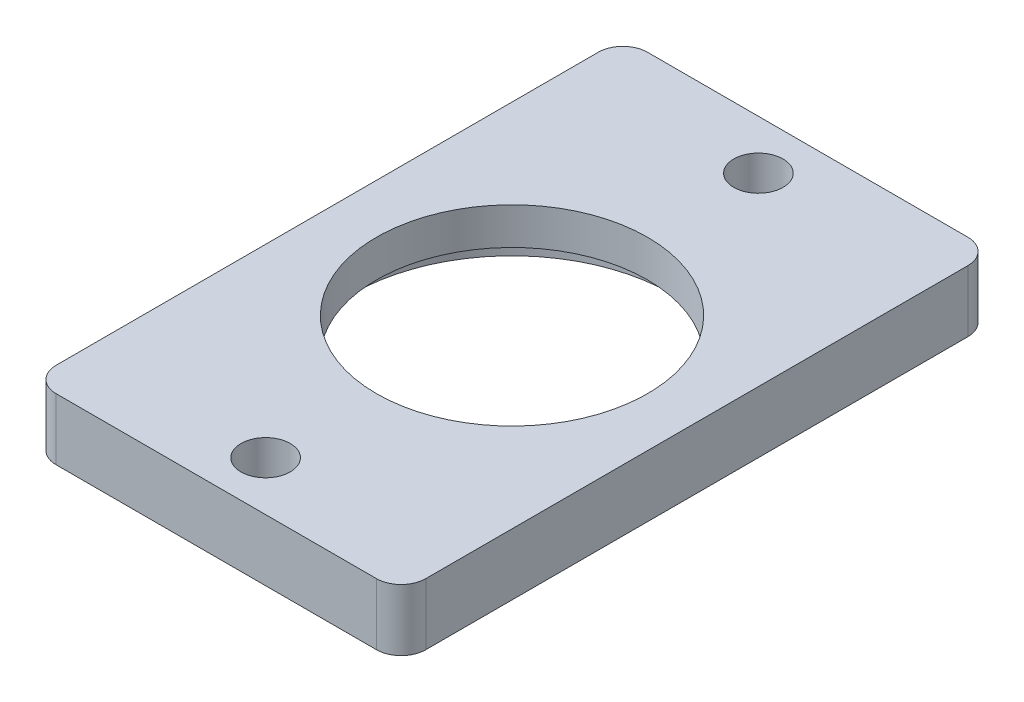
ISO-10303-21;
HEADER;
FILE_DESCRIPTION(('STEP AP214'),'2;1');
FILE_NAME('part.step','',(''),(''),'','','');
FILE_SCHEMA(('AUTOMOTIVE_DESIGN { 1 0 10303 214 1 1 1 1 }'));
ENDSEC;
DATA;
#1=APPLICATION_CONTEXT('core data for automotive mechanical design processes');
#2=APPLICATION_PROTOCOL_DEFINITION('international standard','automotive_design',2000,#1);
#3=PRODUCT_CONTEXT('',#1,'mechanical');
#4=PRODUCT('Part','Part','',(#3));
#5=PRODUCT_RELATED_PRODUCT_CATEGORY('part','',(#4));
#6=PRODUCT_DEFINITION_FORMATION('','',#4);
#7=PRODUCT_DEFINITION_CONTEXT('part definition',#1,'design');
#8=PRODUCT_DEFINITION('design','',#6,#7);
#9=PRODUCT_DEFINITION_SHAPE('','',#8);
#10=(LENGTH_UNIT() NAMED_UNIT(*) SI_UNIT(.MILLI.,.METRE.));
#11=(NAMED_UNIT(*) PLANE_ANGLE_UNIT() SI_UNIT($,.RADIAN.));
#12=(NAMED_UNIT(*) SI_UNIT($,.STERADIAN.) SOLID_ANGLE_UNIT());
#13=UNCERTAINTY_MEASURE_WITH_UNIT(LENGTH_MEASURE(1.E-05),#10,'distance_accuracy_value','');
#14=(GEOMETRIC_REPRESENTATION_CONTEXT(3) GLOBAL_UNCERTAINTY_ASSIGNED_CONTEXT((#13)) GLOBAL_UNIT_ASSIGNED_CONTEXT((#10,
#11,#12)) REPRESENTATION_CONTEXT('',''));
#15=CARTESIAN_POINT('',(0.,0.,0.));
#16=DIRECTION('',(0.,0.,1.));
#17=DIRECTION('',(1.,0.,0.));
#18=AXIS2_PLACEMENT_3D('',#15,#16,#17);
#19=CARTESIAN_POINT('',(-13.,5.,-22.));
#20=DIRECTION('',(0.,-1.,0.));
#21=DIRECTION('',(0.,0.,-1.));
#22=AXIS2_PLACEMENT_3D('',#19,#20,#21);
#23=CYLINDRICAL_SURFACE('',#22,2.);
#24=CARTESIAN_POINT('',(-13.,0.,-22.));
#25=DIRECTION('',(0.,1.,0.));
#26=DIRECTION('',(0.,0.,1.));
#27=AXIS2_PLACEMENT_3D('',#24,#25,#26);
#28=CIRCLE('',#27,2.);
#29=CARTESIAN_POINT('',(-15.,0.,-22.));
#30=VERTEX_POINT('',#29);
#31=CARTESIAN_POINT('',(-13.,0.,-24.));
#32=VERTEX_POINT('',#31);
#33=EDGE_CURVE('E140',#30,#32,#28,.F.);
#34=ORIENTED_EDGE('',*,*,#33,.F.);
#35=DIRECTION('',(0.,-1.,0.));
#36=VECTOR('',#35,1.);
#37=CARTESIAN_POINT('',(-15.,5.,-22.));
#38=LINE('',#37,#36);
#39=CARTESIAN_POINT('',(-15.,5.,-22.));
#40=VERTEX_POINT('',#39);
#41=EDGE_CURVE('E11',#40,#30,#38,.T.);
#42=ORIENTED_EDGE('',*,*,#41,.F.);
#43=CARTESIAN_POINT('',(-13.,5.,-22.));
#44=DIRECTION('',(0.,1.,0.));
#45=DIRECTION('',(0.,0.,1.));
#46=AXIS2_PLACEMENT_3D('',#43,#44,#45);
#47=CIRCLE('',#46,2.);
#48=CARTESIAN_POINT('',(-13.,5.,-24.));
#49=VERTEX_POINT('',#48);
#50=EDGE_CURVE('E165',#40,#49,#47,.F.);
#51=ORIENTED_EDGE('',*,*,#50,.T.);
#52=DIRECTION('',(0.,-1.,0.));
#53=VECTOR('',#52,1.);
#54=CARTESIAN_POINT('',(-13.,5.,-24.));
#55=LINE('',#54,#53);
#56=EDGE_CURVE('E53',#49,#32,#55,.T.);
#57=ORIENTED_EDGE('',*,*,#56,.T.);
#58=EDGE_LOOP('',(#34,#42,#51,#57));
#59=FACE_BOUND('',#58,.T.);
#60=ADVANCED_FACE('F37',(#59),#23,.T.);
#61=CARTESIAN_POINT('',(-15.,5.,0.));
#62=DIRECTION('',(-1.,0.,0.));
#63=DIRECTION('',(0.,0.,1.));
#64=AXIS2_PLACEMENT_3D('',#61,#62,#63);
#65=PLANE('',#64);
#66=DIRECTION('',(0.,0.,-1.));
#67=VECTOR('',#66,1.);
#68=CARTESIAN_POINT('',(-15.,0.,0.));
#69=LINE('',#68,#67);
#70=CARTESIAN_POINT('',(-15.,0.,22.));
#71=VERTEX_POINT('',#70);
#72=EDGE_CURVE('E142',#71,#30,#69,.T.);
#73=ORIENTED_EDGE('',*,*,#72,.F.);
#74=DIRECTION('',(0.,-1.,0.));
#75=VECTOR('',#74,1.);
#76=CARTESIAN_POINT('',(-15.,5.,22.));
#77=LINE('',#76,#75);
#78=CARTESIAN_POINT('',(-15.,5.,22.));
#79=VERTEX_POINT('',#78);
#80=EDGE_CURVE('E45',#79,#71,#77,.T.);
#81=ORIENTED_EDGE('',*,*,#80,.F.);
#82=DIRECTION('',(0.,0.,-1.));
#83=VECTOR('',#82,1.);
#84=CARTESIAN_POINT('',(-15.,5.,0.));
#85=LINE('',#84,#83);
#86=EDGE_CURVE('E199',#79,#40,#85,.T.);
#87=ORIENTED_EDGE('',*,*,#86,.T.);
#88=ORIENTED_EDGE('',*,*,#41,.T.);
#89=EDGE_LOOP('',(#73,#81,#87,#88));
#90=FACE_BOUND('',#89,.T.);
#91=ADVANCED_FACE('F183',(#90),#65,.T.);
#92=CARTESIAN_POINT('',(-13.,5.,22.));
#93=DIRECTION('',(0.,-1.,0.));
#94=DIRECTION('',(0.,0.,-1.));
#95=AXIS2_PLACEMENT_3D('',#92,#93,#94);
#96=CYLINDRICAL_SURFACE('',#95,2.);
#97=CARTESIAN_POINT('',(-13.,0.,22.));
#98=DIRECTION('',(0.,1.,0.));
#99=DIRECTION('',(0.,0.,1.));
#100=AXIS2_PLACEMENT_3D('',#97,#98,#99);
#101=CIRCLE('',#100,2.);
#102=CARTESIAN_POINT('',(-13.,0.,24.));
#103=VERTEX_POINT('',#102);
#104=EDGE_CURVE('E146',#103,#71,#101,.F.);
#105=ORIENTED_EDGE('',*,*,#104,.F.);
#106=DIRECTION('',(0.,-1.,0.));
#107=VECTOR('',#106,1.);
#108=CARTESIAN_POINT('',(-13.,5.,24.));
#109=LINE('',#108,#107);
#110=CARTESIAN_POINT('',(-13.,5.,24.));
#111=VERTEX_POINT('',#110);
#112=EDGE_CURVE('E172',#111,#103,#109,.T.);
#113=ORIENTED_EDGE('',*,*,#112,.F.);
#114=CARTESIAN_POINT('',(-13.,5.,22.));
#115=DIRECTION('',(0.,1.,0.));
#116=DIRECTION('',(0.,0.,1.));
#117=AXIS2_PLACEMENT_3D('',#114,#115,#116);
#118=CIRCLE('',#117,2.);
#119=EDGE_CURVE('E179',#111,#79,#118,.F.);
#120=ORIENTED_EDGE('',*,*,#119,.T.);
#121=ORIENTED_EDGE('',*,*,#80,.T.);
#122=EDGE_LOOP('',(#105,#113,#120,#121));
#123=FACE_BOUND('',#122,.T.);
#124=ADVANCED_FACE('F177',(#123),#96,.T.);
#125=CARTESIAN_POINT('',(0.,5.,24.));
#126=DIRECTION('',(0.,0.,-1.));
#127=DIRECTION('',(-1.,0.,0.));
#128=AXIS2_PLACEMENT_3D('',#125,#126,#127);
#129=PLANE('',#128);
#130=DIRECTION('',(1.,0.,0.));
#131=VECTOR('',#130,1.);
#132=CARTESIAN_POINT('',(0.,0.,24.));
#133=LINE('',#132,#131);
#134=CARTESIAN_POINT('',(13.,0.,24.));
#135=VERTEX_POINT('',#134);
#136=EDGE_CURVE('E149',#103,#135,#133,.T.);
#137=ORIENTED_EDGE('',*,*,#136,.T.);
#138=DIRECTION('',(0.,-1.,0.));
#139=VECTOR('',#138,1.);
#140=CARTESIAN_POINT('',(13.,5.,24.));
#141=LINE('',#140,#139);
#142=CARTESIAN_POINT('',(13.,5.,24.));
#143=VERTEX_POINT('',#142);
#144=EDGE_CURVE('E169',#143,#135,#141,.T.);
#145=ORIENTED_EDGE('',*,*,#144,.F.);
#146=DIRECTION('',(1.,0.,0.));
#147=VECTOR('',#146,1.);
#148=CARTESIAN_POINT('',(0.,5.,24.));
#149=LINE('',#148,#147);
#150=EDGE_CURVE('E195',#111,#143,#149,.T.);
#151=ORIENTED_EDGE('',*,*,#150,.F.);
#152=ORIENTED_EDGE('',*,*,#112,.T.);
#153=EDGE_LOOP('',(#137,#145,#151,#152));
#154=FACE_BOUND('',#153,.T.);
#155=ADVANCED_FACE('F191',(#154),#129,.F.);
#156=CARTESIAN_POINT('',(13.,5.,22.));
#157=DIRECTION('',(0.,-1.,0.));
#158=DIRECTION('',(0.,0.,-1.));
#159=AXIS2_PLACEMENT_3D('',#156,#157,#158);
#160=CYLINDRICAL_SURFACE('',#159,2.);
#161=CARTESIAN_POINT('',(13.,0.,22.));
#162=DIRECTION('',(0.,1.,0.));
#163=DIRECTION('',(0.,0.,1.));
#164=AXIS2_PLACEMENT_3D('',#161,#162,#163);
#165=CIRCLE('',#164,2.);
#166=CARTESIAN_POINT('',(15.,0.,22.));
#167=VERTEX_POINT('',#166);
#168=EDGE_CURVE('E151',#135,#167,#165,.T.);
#169=ORIENTED_EDGE('',*,*,#168,.T.);
#170=DIRECTION('',(0.,-1.,0.));
#171=VECTOR('',#170,1.);
#172=CARTESIAN_POINT('',(15.,5.,22.));
#173=LINE('',#172,#171);
#174=CARTESIAN_POINT('',(15.,5.,22.));
#175=VERTEX_POINT('',#174);
#176=EDGE_CURVE('E123',#175,#167,#173,.T.);
#177=ORIENTED_EDGE('',*,*,#176,.F.);
#178=CARTESIAN_POINT('',(13.,5.,22.));
#179=DIRECTION('',(0.,1.,0.));
#180=DIRECTION('',(0.,0.,1.));
#181=AXIS2_PLACEMENT_3D('',#178,#179,#180);
#182=CIRCLE('',#181,2.);
#183=EDGE_CURVE('E111',#143,#175,#182,.T.);
#184=ORIENTED_EDGE('',*,*,#183,.F.);
#185=ORIENTED_EDGE('',*,*,#144,.T.);
#186=EDGE_LOOP('',(#169,#177,#184,#185));
#187=FACE_BOUND('',#186,.T.);
#188=ADVANCED_FACE('F194',(#187),#160,.T.);
#189=CARTESIAN_POINT('',(15.,5.,0.));
#190=DIRECTION('',(-1.,0.,0.));
#191=DIRECTION('',(0.,0.,1.));
#192=AXIS2_PLACEMENT_3D('',#189,#190,#191);
#193=PLANE('',#192);
#194=DIRECTION('',(0.,0.,-1.));
#195=VECTOR('',#194,1.);
#196=CARTESIAN_POINT('',(15.,0.,0.));
#197=LINE('',#196,#195);
#198=CARTESIAN_POINT('',(15.,0.,-22.));
#199=VERTEX_POINT('',#198);
#200=EDGE_CURVE('E120',#167,#199,#197,.T.);
#201=ORIENTED_EDGE('',*,*,#200,.T.);
#202=DIRECTION('',(0.,-1.,0.));
#203=VECTOR('',#202,1.);
#204=CARTESIAN_POINT('',(15.,5.,-22.));
#205=LINE('',#204,#203);
#206=CARTESIAN_POINT('',(15.,5.,-22.));
#207=VERTEX_POINT('',#206);
#208=EDGE_CURVE('E117',#207,#199,#205,.T.);
#209=ORIENTED_EDGE('',*,*,#208,.F.);
#210=DIRECTION('',(0.,0.,-1.));
#211=VECTOR('',#210,1.);
#212=CARTESIAN_POINT('',(15.,5.,0.));
#213=LINE('',#212,#211);
#214=EDGE_CURVE('E103',#175,#207,#213,.T.);
#215=ORIENTED_EDGE('',*,*,#214,.F.);
#216=ORIENTED_EDGE('',*,*,#176,.T.);
#217=EDGE_LOOP('',(#201,#209,#215,#216));
#218=FACE_BOUND('',#217,.T.);
#219=ADVANCED_FACE('F118',(#218),#193,.F.);
#220=CARTESIAN_POINT('',(13.,5.,-22.));
#221=DIRECTION('',(0.,-1.,0.));
#222=DIRECTION('',(0.,0.,-1.));
#223=AXIS2_PLACEMENT_3D('',#220,#221,#222);
#224=CYLINDRICAL_SURFACE('',#223,2.);
#225=CARTESIAN_POINT('',(13.,0.,-22.));
#226=DIRECTION('',(0.,1.,0.));
#227=DIRECTION('',(0.,0.,1.));
#228=AXIS2_PLACEMENT_3D('',#225,#226,#227);
#229=CIRCLE('',#228,2.);
#230=CARTESIAN_POINT('',(13.,0.,-24.));
#231=VERTEX_POINT('',#230);
#232=EDGE_CURVE('E154',#199,#231,#229,.T.);
#233=ORIENTED_EDGE('',*,*,#232,.T.);
#234=DIRECTION('',(0.,-1.,0.));
#235=VECTOR('',#234,1.);
#236=CARTESIAN_POINT('',(13.,5.,-24.));
#237=LINE('',#236,#235);
#238=CARTESIAN_POINT('',(13.,5.,-24.));
#239=VERTEX_POINT('',#238);
#240=EDGE_CURVE('E79',#239,#231,#237,.T.);
#241=ORIENTED_EDGE('',*,*,#240,.F.);
#242=CARTESIAN_POINT('',(13.,5.,-22.));
#243=DIRECTION('',(0.,1.,0.));
#244=DIRECTION('',(0.,0.,1.));
#245=AXIS2_PLACEMENT_3D('',#242,#243,#244);
#246=CIRCLE('',#245,2.);
#247=EDGE_CURVE('E109',#207,#239,#246,.T.);
#248=ORIENTED_EDGE('',*,*,#247,.F.);
#249=ORIENTED_EDGE('',*,*,#208,.T.);
#250=EDGE_LOOP('',(#233,#241,#248,#249));
#251=FACE_BOUND('',#250,.T.);
#252=ADVANCED_FACE('F125',(#251),#224,.T.);
#253=CARTESIAN_POINT('',(0.,5.,-20.));
#254=DIRECTION('',(0.,-1.,0.));
#255=DIRECTION('',(0.,0.,-1.));
#256=AXIS2_PLACEMENT_3D('',#253,#254,#255);
#257=CYLINDRICAL_SURFACE('',#256,2.);
#258=CARTESIAN_POINT('',(0.,5.,-20.));
#259=DIRECTION('',(0.,1.,0.));
#260=DIRECTION('',(0.,0.,1.));
#261=AXIS2_PLACEMENT_3D('',#258,#259,#260);
#262=CIRCLE('',#261,2.);
#263=CARTESIAN_POINT('',(0.,5.,-18.));
#264=VERTEX_POINT('',#263);
#265=EDGE_CURVE('E134',#264,#264,#262,.T.);
#266=ORIENTED_EDGE('',*,*,#265,.T.);
#267=EDGE_LOOP('',(#266));
#268=FACE_BOUND('',#267,.T.);
#269=CARTESIAN_POINT('',(0.,0.,-20.));
#270=DIRECTION('',(0.,1.,0.));
#271=DIRECTION('',(0.,0.,1.));
#272=AXIS2_PLACEMENT_3D('',#269,#270,#271);
#273=CIRCLE('',#272,2.);
#274=CARTESIAN_POINT('',(0.,0.,-18.));
#275=VERTEX_POINT('',#274);
#276=EDGE_CURVE('E162',#275,#275,#273,.T.);
#277=ORIENTED_EDGE('',*,*,#276,.F.);
#278=EDGE_LOOP('',(#277));
#279=FACE_BOUND('',#278,.T.);
#280=ADVANCED_FACE('F240',(#268,#279),#257,.F.);
#281=CARTESIAN_POINT('',(0.,5.,20.));
#282=DIRECTION('',(0.,-1.,0.));
#283=DIRECTION('',(0.,0.,-1.));
#284=AXIS2_PLACEMENT_3D('',#281,#282,#283);
#285=CYLINDRICAL_SURFACE('',#284,2.);
#286=CARTESIAN_POINT('',(0.,5.,20.));
#287=DIRECTION('',(0.,1.,0.));
#288=DIRECTION('',(0.,0.,1.));
#289=AXIS2_PLACEMENT_3D('',#286,#287,#288);
#290=CIRCLE('',#289,2.);
#291=CARTESIAN_POINT('',(0.,5.,22.));
#292=VERTEX_POINT('',#291);
#293=EDGE_CURVE('E128',#292,#292,#290,.T.);
#294=ORIENTED_EDGE('',*,*,#293,.T.);
#295=EDGE_LOOP('',(#294));
#296=FACE_BOUND('',#295,.T.);
#297=CARTESIAN_POINT('',(0.,0.,20.));
#298=DIRECTION('',(0.,1.,0.));
#299=DIRECTION('',(0.,0.,1.));
#300=AXIS2_PLACEMENT_3D('',#297,#298,#299);
#301=CIRCLE('',#300,2.);
#302=CARTESIAN_POINT('',(0.,0.,22.));
#303=VERTEX_POINT('',#302);
#304=EDGE_CURVE('E159',#303,#303,#301,.T.);
#305=ORIENTED_EDGE('',*,*,#304,.F.);
#306=EDGE_LOOP('',(#305));
#307=FACE_BOUND('',#306,.T.);
#308=ADVANCED_FACE('F235',(#296,#307),#285,.F.);
#309=CARTESIAN_POINT('',(0.,5.,-24.));
#310=DIRECTION('',(0.,0.,-1.));
#311=DIRECTION('',(-1.,0.,0.));
#312=AXIS2_PLACEMENT_3D('',#309,#310,#311);
#313=PLANE('',#312);
#314=DIRECTION('',(1.,0.,0.));
#315=VECTOR('',#314,1.);
#316=CARTESIAN_POINT('',(0.,0.,-24.));
#317=LINE('',#316,#315);
#318=EDGE_CURVE('E156',#32,#231,#317,.T.);
#319=ORIENTED_EDGE('',*,*,#318,.F.);
#320=ORIENTED_EDGE('',*,*,#56,.F.);
#321=DIRECTION('',(1.,0.,0.));
#322=VECTOR('',#321,1.);
#323=CARTESIAN_POINT('',(0.,5.,-24.));
#324=LINE('',#323,#322);
#325=EDGE_CURVE('E126',#49,#239,#324,.T.);
#326=ORIENTED_EDGE('',*,*,#325,.T.);
#327=ORIENTED_EDGE('',*,*,#240,.T.);
#328=EDGE_LOOP('',(#319,#320,#326,#327));
#329=FACE_BOUND('',#328,.T.);
#330=ADVANCED_FACE('F217',(#329),#313,.T.);
#331=CARTESIAN_POINT('',(0.,5.,0.));
#332=DIRECTION('',(0.,-1.,0.));
#333=DIRECTION('',(0.,0.,-1.));
#334=AXIS2_PLACEMENT_3D('',#331,#332,#333);
#335=CYLINDRICAL_SURFACE('',#334,11.);
#336=CARTESIAN_POINT('',(0.,2.,0.));
#337=DIRECTION('',(0.,1.,0.));
#338=DIRECTION('',(0.,0.,1.));
#339=AXIS2_PLACEMENT_3D('',#336,#337,#338);
#340=CIRCLE('',#339,11.);
#341=CARTESIAN_POINT('',(0.,2.,11.));
#342=VERTEX_POINT('',#341);
#343=EDGE_CURVE('E205',#342,#342,#340,.T.);
#344=ORIENTED_EDGE('',*,*,#343,.F.);
#345=EDGE_LOOP('',(#344));
#346=FACE_BOUND('',#345,.T.);
#347=CARTESIAN_POINT('',(0.,5.,0.));
#348=DIRECTION('',(0.,1.,0.));
#349=DIRECTION('',(0.,0.,1.));
#350=AXIS2_PLACEMENT_3D('',#347,#348,#349);
#351=CIRCLE('',#350,11.);
#352=CARTESIAN_POINT('',(0.,5.,11.));
#353=VERTEX_POINT('',#352);
#354=EDGE_CURVE('E137',#353,#353,#351,.T.);
#355=ORIENTED_EDGE('',*,*,#354,.T.);
#356=EDGE_LOOP('',(#355));
#357=FACE_BOUND('',#356,.T.);
#358=ADVANCED_FACE('F214',(#346,#357),#335,.F.);
#359=CARTESIAN_POINT('',(0.,5.,0.));
#360=DIRECTION('',(0.,1.,0.));
#361=DIRECTION('',(0.,0.,1.));
#362=AXIS2_PLACEMENT_3D('',#359,#360,#361);
#363=PLANE('',#362);
#364=ORIENTED_EDGE('',*,*,#50,.F.);
#365=ORIENTED_EDGE('',*,*,#86,.F.);
#366=ORIENTED_EDGE('',*,*,#119,.F.);
#367=ORIENTED_EDGE('',*,*,#150,.T.);
#368=ORIENTED_EDGE('',*,*,#183,.T.);
#369=ORIENTED_EDGE('',*,*,#214,.T.);
#370=ORIENTED_EDGE('',*,*,#247,.T.);
#371=ORIENTED_EDGE('',*,*,#325,.F.);
#372=EDGE_LOOP('',(#364,#365,#366,#367,#368,#369,#370,#371));
#373=FACE_BOUND('',#372,.T.);
#374=ORIENTED_EDGE('',*,*,#293,.F.);
#375=EDGE_LOOP('',(#374));
#376=FACE_BOUND('',#375,.T.);
#377=ORIENTED_EDGE('',*,*,#265,.F.);
#378=EDGE_LOOP('',(#377));
#379=FACE_BOUND('',#378,.T.);
#380=ORIENTED_EDGE('',*,*,#354,.F.);
#381=EDGE_LOOP('',(#380));
#382=FACE_BOUND('',#381,.T.);
#383=ADVANCED_FACE('F105',(#373,#376,#379,#382),#363,.T.);
#384=CARTESIAN_POINT('',(0.,0.,0.));
#385=DIRECTION('',(0.,1.,0.));
#386=DIRECTION('',(0.,0.,1.));
#387=AXIS2_PLACEMENT_3D('',#384,#385,#386);
#388=PLANE('',#387);
#389=CARTESIAN_POINT('',(0.,0.,0.));
#390=DIRECTION('',(0.,1.,0.));
#391=DIRECTION('',(0.,0.,1.));
#392=AXIS2_PLACEMENT_3D('',#389,#390,#391);
#393=CIRCLE('',#392,13.);
#394=CARTESIAN_POINT('',(0.,0.,13.));
#395=VERTEX_POINT('',#394);
#396=EDGE_CURVE('E202',#395,#395,#393,.T.);
#397=ORIENTED_EDGE('',*,*,#396,.T.);
#398=EDGE_LOOP('',(#397));
#399=FACE_BOUND('',#398,.T.);
#400=ORIENTED_EDGE('',*,*,#33,.T.);
#401=ORIENTED_EDGE('',*,*,#318,.T.);
#402=ORIENTED_EDGE('',*,*,#232,.F.);
#403=ORIENTED_EDGE('',*,*,#200,.F.);
#404=ORIENTED_EDGE('',*,*,#168,.F.);
#405=ORIENTED_EDGE('',*,*,#136,.F.);
#406=ORIENTED_EDGE('',*,*,#104,.T.);
#407=ORIENTED_EDGE('',*,*,#72,.T.);
#408=EDGE_LOOP('',(#400,#401,#402,#403,#404,#405,#406,#407));
#409=FACE_BOUND('',#408,.T.);
#410=ORIENTED_EDGE('',*,*,#304,.T.);
#411=EDGE_LOOP('',(#410));
#412=FACE_BOUND('',#411,.T.);
#413=ORIENTED_EDGE('',*,*,#276,.T.);
#414=EDGE_LOOP('',(#413));
#415=FACE_BOUND('',#414,.T.);
#416=ADVANCED_FACE('F186',(#399,#409,#412,#415),#388,.F.);
#417=CARTESIAN_POINT('',(0.,2.,0.));
#418=DIRECTION('',(0.,-1.,0.));
#419=DIRECTION('',(0.,0.,-1.));
#420=AXIS2_PLACEMENT_3D('',#417,#418,#419);
#421=CYLINDRICAL_SURFACE('',#420,13.);
#422=CARTESIAN_POINT('',(0.,2.,0.));
#423=DIRECTION('',(0.,1.,0.));
#424=DIRECTION('',(0.,0.,1.));
#425=AXIS2_PLACEMENT_3D('',#422,#423,#424);
#426=CIRCLE('',#425,13.);
#427=CARTESIAN_POINT('',(0.,2.,13.));
#428=VERTEX_POINT('',#427);
#429=EDGE_CURVE('E143',#428,#428,#426,.T.);
#430=ORIENTED_EDGE('',*,*,#429,.T.);
#431=EDGE_LOOP('',(#430));
#432=FACE_BOUND('',#431,.T.);
#433=ORIENTED_EDGE('',*,*,#396,.F.);
#434=EDGE_LOOP('',(#433));
#435=FACE_BOUND('',#434,.T.);
#436=ADVANCED_FACE('F226',(#432,#435),#421,.F.);
#437=CARTESIAN_POINT('',(0.,2.,0.));
#438=DIRECTION('',(0.,1.,0.));
#439=DIRECTION('',(0.,0.,1.));
#440=AXIS2_PLACEMENT_3D('',#437,#438,#439);
#441=PLANE('',#440);
#442=ORIENTED_EDGE('',*,*,#343,.T.);
#443=EDGE_LOOP('',(#442));
#444=FACE_BOUND('',#443,.T.);
#445=ORIENTED_EDGE('',*,*,#429,.F.);
#446=EDGE_LOOP('',(#445));
#447=FACE_BOUND('',#446,.T.);
#448=ADVANCED_FACE('F211',(#444,#447),#441,.F.);
#449=CLOSED_SHELL('',(#60,#91,#124,#155,#188,#219,#252,#280,#308,#330,#358,#383,#416,#436,#448));
#450=MANIFOLD_SOLID_BREP('B2',#449);
#451=ADVANCED_BREP_SHAPE_REPRESENTATION('',(#18,#450),#14);
#452=SHAPE_DEFINITION_REPRESENTATION(#9,#451);
ENDSEC;
END-ISO-10303-21;
